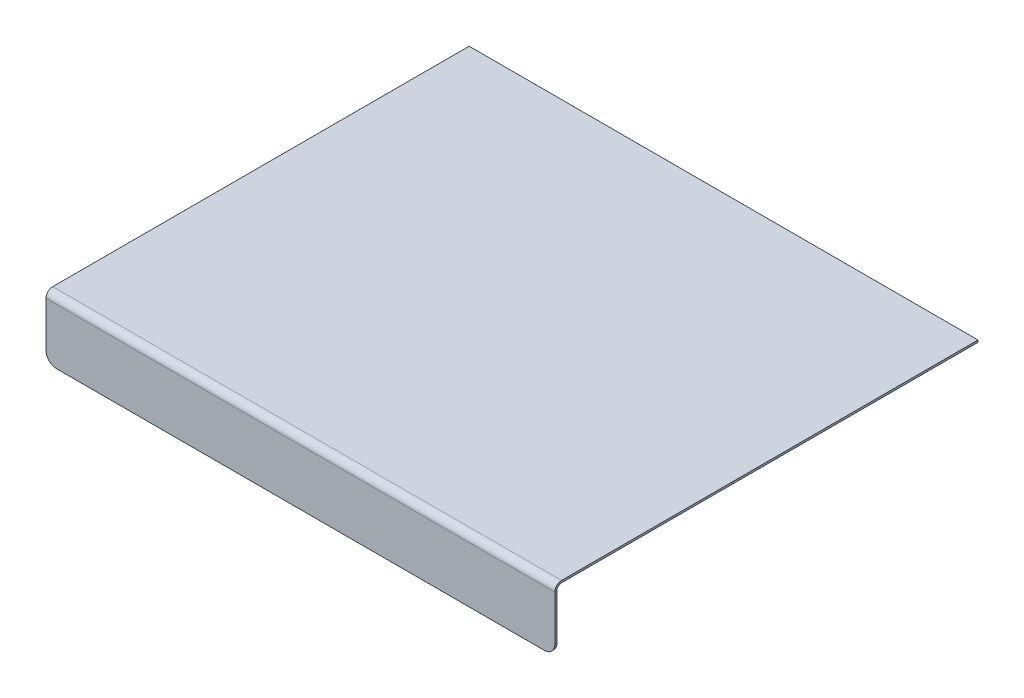
ISO-10303-21;
HEADER;
FILE_DESCRIPTION(('STEP AP214'),'2;1');
FILE_NAME('part.step','',(''),(''),'','','');
FILE_SCHEMA(('AUTOMOTIVE_DESIGN { 1 0 10303 214 1 1 1 1 }'));
ENDSEC;
DATA;
#1=APPLICATION_CONTEXT('core data for automotive mechanical design processes');
#2=APPLICATION_PROTOCOL_DEFINITION('international standard','automotive_design',2000,#1);
#3=PRODUCT_CONTEXT('',#1,'mechanical');
#4=PRODUCT('Part','Part','',(#3));
#5=PRODUCT_RELATED_PRODUCT_CATEGORY('part','',(#4));
#6=PRODUCT_DEFINITION_FORMATION('','',#4);
#7=PRODUCT_DEFINITION_CONTEXT('part definition',#1,'design');
#8=PRODUCT_DEFINITION('design','',#6,#7);
#9=PRODUCT_DEFINITION_SHAPE('','',#8);
#10=(LENGTH_UNIT() NAMED_UNIT(*) SI_UNIT(.MILLI.,.METRE.));
#11=(NAMED_UNIT(*) PLANE_ANGLE_UNIT() SI_UNIT($,.RADIAN.));
#12=(NAMED_UNIT(*) SI_UNIT($,.STERADIAN.) SOLID_ANGLE_UNIT());
#13=UNCERTAINTY_MEASURE_WITH_UNIT(LENGTH_MEASURE(1.E-05),#10,'distance_accuracy_value','');
#14=(GEOMETRIC_REPRESENTATION_CONTEXT(3) GLOBAL_UNCERTAINTY_ASSIGNED_CONTEXT((#13)) GLOBAL_UNIT_ASSIGNED_CONTEXT((#10,
#11,#12)) REPRESENTATION_CONTEXT('',''));
#15=CARTESIAN_POINT('',(0.,0.,0.));
#16=DIRECTION('',(0.,0.,1.));
#17=DIRECTION('',(1.,0.,0.));
#18=AXIS2_PLACEMENT_3D('',#15,#16,#17);
#19=CARTESIAN_POINT('',(-11.811,1.23410604029978,-36.8905693736669));
#20=DIRECTION('',(0.,0.,1.));
#21=DIRECTION('',(1.,0.,0.));
#22=AXIS2_PLACEMENT_3D('',#19,#20,#21);
#23=CYLINDRICAL_SURFACE('',#22,0.508);
#24=DIRECTION('',(0.,0.,1.));
#25=VECTOR('',#24,1.);
#26=CARTESIAN_POINT('',(-12.319,1.23410604029978,-36.8905693736669));
#27=LINE('',#26,#25);
#28=CARTESIAN_POINT('',(-12.319,1.23410604029978,-36.9896293736669));
#29=VERTEX_POINT('',#28);
#30=CARTESIAN_POINT('',(-12.319,1.23410604029978,-36.8905693736669));
#31=VERTEX_POINT('',#30);
#32=EDGE_CURVE('E13',#29,#31,#27,.T.);
#33=ORIENTED_EDGE('',*,*,#32,.F.);
#34=CARTESIAN_POINT('',(-11.811,1.23410604029978,-36.9896293736669));
#35=DIRECTION('',(0.,0.,1.));
#36=DIRECTION('',(1.,0.,0.));
#37=AXIS2_PLACEMENT_3D('',#34,#35,#36);
#38=CIRCLE('',#37,0.508);
#39=CARTESIAN_POINT('',(-11.811,0.72610604029978,-36.9896293736669));
#40=VERTEX_POINT('',#39);
#41=EDGE_CURVE('E105',#29,#40,#38,.T.);
#42=ORIENTED_EDGE('',*,*,#41,.T.);
#43=DIRECTION('',(0.,0.,1.));
#44=VECTOR('',#43,1.);
#45=CARTESIAN_POINT('',(-11.811,0.726106040299779,-36.8905693736669));
#46=LINE('',#45,#44);
#47=CARTESIAN_POINT('',(-11.811,0.726106040299779,-36.8905693736669));
#48=VERTEX_POINT('',#47);
#49=EDGE_CURVE('E60',#40,#48,#46,.T.);
#50=ORIENTED_EDGE('',*,*,#49,.T.);
#51=CARTESIAN_POINT('',(-11.811,1.23410604029978,-36.8905693736669));
#52=DIRECTION('',(0.,0.,1.));
#53=DIRECTION('',(1.,0.,0.));
#54=AXIS2_PLACEMENT_3D('',#51,#52,#53);
#55=CIRCLE('',#54,0.508);
#56=EDGE_CURVE('E107',#31,#48,#55,.T.);
#57=ORIENTED_EDGE('',*,*,#56,.F.);
#58=EDGE_LOOP('',(#33,#42,#50,#57));
#59=FACE_BOUND('',#58,.T.);
#60=ADVANCED_FACE('F50',(#59),#23,.T.);
#61=CARTESIAN_POINT('',(12.319,0.726106040299779,-36.8905693736669));
#62=DIRECTION('',(0.,1.,0.));
#63=DIRECTION('',(-1.,0.,0.));
#64=AXIS2_PLACEMENT_3D('',#61,#62,#63);
#65=PLANE('',#64);
#66=ORIENTED_EDGE('',*,*,#49,.F.);
#67=DIRECTION('',(1.,0.,0.));
#68=VECTOR('',#67,1.);
#69=CARTESIAN_POINT('',(12.319,0.72610604029978,-36.9896293736669));
#70=LINE('',#69,#68);
#71=CARTESIAN_POINT('',(11.811,0.72610604029978,-36.9896293736669));
#72=VERTEX_POINT('',#71);
#73=EDGE_CURVE('E121',#72,#40,#70,.F.);
#74=ORIENTED_EDGE('',*,*,#73,.F.);
#75=DIRECTION('',(0.,0.,1.));
#76=VECTOR('',#75,1.);
#77=CARTESIAN_POINT('',(11.811,0.726106040299779,-36.8905693736669));
#78=LINE('',#77,#76);
#79=CARTESIAN_POINT('',(11.811,0.726106040299779,-36.8905693736669));
#80=VERTEX_POINT('',#79);
#81=EDGE_CURVE('E144',#72,#80,#78,.T.);
#82=ORIENTED_EDGE('',*,*,#81,.T.);
#83=DIRECTION('',(-1.,0.,0.));
#84=VECTOR('',#83,1.);
#85=CARTESIAN_POINT('',(12.319,0.726106040299779,-36.8905693736669));
#86=LINE('',#85,#84);
#87=EDGE_CURVE('E156',#80,#48,#86,.T.);
#88=ORIENTED_EDGE('',*,*,#87,.T.);
#89=EDGE_LOOP('',(#66,#74,#82,#88));
#90=FACE_BOUND('',#89,.T.);
#91=ADVANCED_FACE('F161',(#90),#65,.F.);
#92=CARTESIAN_POINT('',(11.811,1.23410604029978,-36.8905693736669));
#93=DIRECTION('',(0.,0.,1.));
#94=DIRECTION('',(1.,0.,0.));
#95=AXIS2_PLACEMENT_3D('',#92,#93,#94);
#96=CYLINDRICAL_SURFACE('',#95,0.508);
#97=ORIENTED_EDGE('',*,*,#81,.F.);
#98=CARTESIAN_POINT('',(11.811,1.23410604029978,-36.9896293736669));
#99=DIRECTION('',(0.,0.,1.));
#100=DIRECTION('',(1.,0.,0.));
#101=AXIS2_PLACEMENT_3D('',#98,#99,#100);
#102=CIRCLE('',#101,0.508);
#103=CARTESIAN_POINT('',(12.319,1.23410604029978,-36.9896293736669));
#104=VERTEX_POINT('',#103);
#105=EDGE_CURVE('E211',#72,#104,#102,.T.);
#106=ORIENTED_EDGE('',*,*,#105,.T.);
#107=DIRECTION('',(0.,0.,1.));
#108=VECTOR('',#107,1.);
#109=CARTESIAN_POINT('',(12.319,1.23410604029978,-36.8905693736669));
#110=LINE('',#109,#108);
#111=CARTESIAN_POINT('',(12.319,1.23410604029978,-36.8905693736669));
#112=VERTEX_POINT('',#111);
#113=EDGE_CURVE('E141',#104,#112,#110,.T.);
#114=ORIENTED_EDGE('',*,*,#113,.T.);
#115=CARTESIAN_POINT('',(11.811,1.23410604029978,-36.8905693736669));
#116=DIRECTION('',(0.,0.,1.));
#117=DIRECTION('',(1.,0.,0.));
#118=AXIS2_PLACEMENT_3D('',#115,#116,#117);
#119=CIRCLE('',#118,0.508);
#120=EDGE_CURVE('E162',#80,#112,#119,.T.);
#121=ORIENTED_EDGE('',*,*,#120,.F.);
#122=EDGE_LOOP('',(#97,#106,#114,#121));
#123=FACE_BOUND('',#122,.T.);
#124=ADVANCED_FACE('F214',(#123),#96,.T.);
#125=CARTESIAN_POINT('',(12.319,1.29760604029978,-36.8905693736669));
#126=DIRECTION('',(1.,0.,0.));
#127=DIRECTION('',(0.,1.,0.));
#128=AXIS2_PLACEMENT_3D('',#125,#126,#127);
#129=PLANE('',#128);
#130=ORIENTED_EDGE('',*,*,#113,.F.);
#131=DIRECTION('',(0.,1.,0.));
#132=VECTOR('',#131,1.);
#133=CARTESIAN_POINT('',(12.319,1.29760604029978,-36.9896293736669));
#134=LINE('',#133,#132);
#135=CARTESIAN_POINT('',(12.319,3.42610604029978,-36.9896293736669));
#136=VERTEX_POINT('',#135);
#137=EDGE_CURVE('E192',#104,#136,#134,.T.);
#138=ORIENTED_EDGE('',*,*,#137,.T.);
#139=DIRECTION('',(0.,0.,1.));
#140=VECTOR('',#139,1.);
#141=CARTESIAN_POINT('',(12.319,3.42610604029978,-36.8905693736669));
#142=LINE('',#141,#140);
#143=CARTESIAN_POINT('',(12.319,3.42610604029978,-36.8905693736669));
#144=VERTEX_POINT('',#143);
#145=EDGE_CURVE('E138',#136,#144,#142,.T.);
#146=ORIENTED_EDGE('',*,*,#145,.T.);
#147=DIRECTION('',(0.,1.,0.));
#148=VECTOR('',#147,1.);
#149=CARTESIAN_POINT('',(12.319,1.29760604029978,-36.8905693736669));
#150=LINE('',#149,#148);
#151=EDGE_CURVE('E164',#112,#144,#150,.T.);
#152=ORIENTED_EDGE('',*,*,#151,.F.);
#153=EDGE_LOOP('',(#130,#138,#146,#152));
#154=FACE_BOUND('',#153,.T.);
#155=ADVANCED_FACE('F219',(#154),#129,.T.);
#156=CARTESIAN_POINT('',(12.319,3.42610604029978,-37.2146293736669));
#157=DIRECTION('',(-1.,0.,0.));
#158=DIRECTION('',(0.,0.,1.));
#159=AXIS2_PLACEMENT_3D('',#156,#157,#158);
#160=PLANE('',#159);
#161=ORIENTED_EDGE('',*,*,#145,.F.);
#162=CARTESIAN_POINT('',(12.319,3.42610604029978,-37.2146293736669));
#163=DIRECTION('',(-1.,0.,0.));
#164=DIRECTION('',(0.,0.,1.));
#165=AXIS2_PLACEMENT_3D('',#162,#163,#164);
#166=CIRCLE('',#165,0.225000000000002);
#167=CARTESIAN_POINT('',(12.319,3.65110604029978,-37.2146293736669));
#168=VERTEX_POINT('',#167);
#169=EDGE_CURVE('E200',#136,#168,#166,.T.);
#170=ORIENTED_EDGE('',*,*,#169,.T.);
#171=DIRECTION('',(0.,1.,0.));
#172=VECTOR('',#171,1.);
#173=CARTESIAN_POINT('',(12.319,3.75016604029978,-37.2146293736669));
#174=LINE('',#173,#172);
#175=CARTESIAN_POINT('',(12.319,3.75016604029978,-37.2146293736669));
#176=VERTEX_POINT('',#175);
#177=EDGE_CURVE('E135',#168,#176,#174,.T.);
#178=ORIENTED_EDGE('',*,*,#177,.T.);
#179=CARTESIAN_POINT('',(12.319,3.42610604029978,-37.2146293736669));
#180=DIRECTION('',(1.,0.,0.));
#181=DIRECTION('',(0.,0.,-1.));
#182=AXIS2_PLACEMENT_3D('',#179,#180,#181);
#183=CIRCLE('',#182,0.324060000000002);
#184=EDGE_CURVE('E186',#144,#176,#183,.F.);
#185=ORIENTED_EDGE('',*,*,#184,.F.);
#186=EDGE_LOOP('',(#161,#170,#178,#185));
#187=FACE_BOUND('',#186,.T.);
#188=ADVANCED_FACE('F227',(#187),#160,.F.);
#189=CARTESIAN_POINT('',(12.319,3.75016604029978,-37.2146293736669));
#190=DIRECTION('',(1.,0.,0.));
#191=DIRECTION('',(0.,0.,-1.));
#192=AXIS2_PLACEMENT_3D('',#189,#190,#191);
#193=PLANE('',#192);
#194=ORIENTED_EDGE('',*,*,#177,.F.);
#195=DIRECTION('',(0.,0.,1.));
#196=VECTOR('',#195,1.);
#197=CARTESIAN_POINT('',(12.319,3.65110604029978,-37.2146293736669));
#198=LINE('',#197,#196);
#199=CARTESIAN_POINT('',(12.319,3.65110604029978,-57.3800335132662));
#200=VERTEX_POINT('',#199);
#201=EDGE_CURVE('E196',#168,#200,#198,.F.);
#202=ORIENTED_EDGE('',*,*,#201,.T.);
#203=DIRECTION('',(0.,1.,0.));
#204=VECTOR('',#203,1.);
#205=CARTESIAN_POINT('',(12.319,3.75016604029978,-57.3800335132662));
#206=LINE('',#205,#204);
#207=CARTESIAN_POINT('',(12.319,3.75016604029978,-57.3800335132662));
#208=VERTEX_POINT('',#207);
#209=EDGE_CURVE('E133',#200,#208,#206,.T.);
#210=ORIENTED_EDGE('',*,*,#209,.T.);
#211=DIRECTION('',(0.,0.,-1.));
#212=VECTOR('',#211,1.);
#213=CARTESIAN_POINT('',(12.319,3.75016604029978,-37.2146293736669));
#214=LINE('',#213,#212);
#215=EDGE_CURVE('E178',#176,#208,#214,.T.);
#216=ORIENTED_EDGE('',*,*,#215,.F.);
#217=EDGE_LOOP('',(#194,#202,#210,#216));
#218=FACE_BOUND('',#217,.T.);
#219=ADVANCED_FACE('F272',(#218),#193,.T.);
#220=CARTESIAN_POINT('',(12.319,3.75016604029978,-57.3800335132662));
#221=DIRECTION('',(0.,0.,-1.));
#222=DIRECTION('',(-1.,0.,0.));
#223=AXIS2_PLACEMENT_3D('',#220,#221,#222);
#224=PLANE('',#223);
#225=ORIENTED_EDGE('',*,*,#209,.F.);
#226=DIRECTION('',(1.,0.,0.));
#227=VECTOR('',#226,1.);
#228=CARTESIAN_POINT('',(12.319,3.65110604029978,-57.3800335132662));
#229=LINE('',#228,#227);
#230=CARTESIAN_POINT('',(-12.319,3.65110604029978,-57.3800335132662));
#231=VERTEX_POINT('',#230);
#232=EDGE_CURVE('E201',#200,#231,#229,.F.);
#233=ORIENTED_EDGE('',*,*,#232,.T.);
#234=DIRECTION('',(0.,1.,0.));
#235=VECTOR('',#234,1.);
#236=CARTESIAN_POINT('',(-12.319,3.75016604029978,-57.3800335132662));
#237=LINE('',#236,#235);
#238=CARTESIAN_POINT('',(-12.319,3.75016604029978,-57.3800335132662));
#239=VERTEX_POINT('',#238);
#240=EDGE_CURVE('E68',#231,#239,#237,.T.);
#241=ORIENTED_EDGE('',*,*,#240,.T.);
#242=DIRECTION('',(-1.,0.,0.));
#243=VECTOR('',#242,1.);
#244=CARTESIAN_POINT('',(12.319,3.75016604029978,-57.3800335132662));
#245=LINE('',#244,#243);
#246=EDGE_CURVE('E181',#208,#239,#245,.T.);
#247=ORIENTED_EDGE('',*,*,#246,.F.);
#248=EDGE_LOOP('',(#225,#233,#241,#247));
#249=FACE_BOUND('',#248,.T.);
#250=ADVANCED_FACE('F257',(#249),#224,.T.);
#251=CARTESIAN_POINT('',(-12.319,3.75016604029978,-37.2146293736669));
#252=DIRECTION('',(1.,0.,0.));
#253=DIRECTION('',(0.,0.,-1.));
#254=AXIS2_PLACEMENT_3D('',#251,#252,#253);
#255=PLANE('',#254);
#256=ORIENTED_EDGE('',*,*,#240,.F.);
#257=DIRECTION('',(0.,0.,1.));
#258=VECTOR('',#257,1.);
#259=CARTESIAN_POINT('',(-12.319,3.65110604029978,-37.2146293736669));
#260=LINE('',#259,#258);
#261=CARTESIAN_POINT('',(-12.319,3.65110604029978,-37.2146293736669));
#262=VERTEX_POINT('',#261);
#263=EDGE_CURVE('E191',#262,#231,#260,.F.);
#264=ORIENTED_EDGE('',*,*,#263,.F.);
#265=DIRECTION('',(0.,1.,0.));
#266=VECTOR('',#265,1.);
#267=CARTESIAN_POINT('',(-12.319,3.75016604029978,-37.2146293736669));
#268=LINE('',#267,#266);
#269=CARTESIAN_POINT('',(-12.319,3.75016604029978,-37.2146293736669));
#270=VERTEX_POINT('',#269);
#271=EDGE_CURVE('E129',#262,#270,#268,.T.);
#272=ORIENTED_EDGE('',*,*,#271,.T.);
#273=DIRECTION('',(0.,0.,-1.));
#274=VECTOR('',#273,1.);
#275=CARTESIAN_POINT('',(-12.319,3.75016604029978,-37.2146293736669));
#276=LINE('',#275,#274);
#277=EDGE_CURVE('E172',#270,#239,#276,.T.);
#278=ORIENTED_EDGE('',*,*,#277,.T.);
#279=EDGE_LOOP('',(#256,#264,#272,#278));
#280=FACE_BOUND('',#279,.T.);
#281=ADVANCED_FACE('F247',(#280),#255,.F.);
#282=CARTESIAN_POINT('',(-12.319,3.42610604029978,-37.2146293736669));
#283=DIRECTION('',(-1.,0.,0.));
#284=DIRECTION('',(0.,0.,1.));
#285=AXIS2_PLACEMENT_3D('',#282,#283,#284);
#286=PLANE('',#285);
#287=ORIENTED_EDGE('',*,*,#271,.F.);
#288=CARTESIAN_POINT('',(-12.319,3.42610604029978,-37.2146293736669));
#289=DIRECTION('',(-1.,0.,0.));
#290=DIRECTION('',(0.,0.,1.));
#291=AXIS2_PLACEMENT_3D('',#288,#289,#290);
#292=CIRCLE('',#291,0.225000000000002);
#293=CARTESIAN_POINT('',(-12.319,3.42610604029978,-36.9896293736669));
#294=VERTEX_POINT('',#293);
#295=EDGE_CURVE('E197',#294,#262,#292,.T.);
#296=ORIENTED_EDGE('',*,*,#295,.F.);
#297=DIRECTION('',(0.,0.,1.));
#298=VECTOR('',#297,1.);
#299=CARTESIAN_POINT('',(-12.319,3.42610604029978,-36.8905693736669));
#300=LINE('',#299,#298);
#301=CARTESIAN_POINT('',(-12.319,3.42610604029978,-36.8905693736669));
#302=VERTEX_POINT('',#301);
#303=EDGE_CURVE('E54',#294,#302,#300,.T.);
#304=ORIENTED_EDGE('',*,*,#303,.T.);
#305=CARTESIAN_POINT('',(-12.319,3.42610604029978,-37.2146293736669));
#306=DIRECTION('',(1.,0.,0.));
#307=DIRECTION('',(0.,0.,-1.));
#308=AXIS2_PLACEMENT_3D('',#305,#306,#307);
#309=CIRCLE('',#308,0.324060000000002);
#310=EDGE_CURVE('E183',#302,#270,#309,.F.);
#311=ORIENTED_EDGE('',*,*,#310,.T.);
#312=EDGE_LOOP('',(#287,#296,#304,#311));
#313=FACE_BOUND('',#312,.T.);
#314=ADVANCED_FACE('F250',(#313),#286,.T.);
#315=CARTESIAN_POINT('',(-12.319,1.29760604029978,-36.8905693736669));
#316=DIRECTION('',(1.,0.,0.));
#317=DIRECTION('',(0.,1.,0.));
#318=AXIS2_PLACEMENT_3D('',#315,#316,#317);
#319=PLANE('',#318);
#320=DIRECTION('',(0.,1.,0.));
#321=VECTOR('',#320,1.);
#322=CARTESIAN_POINT('',(-12.319,1.29760604029978,-36.9896293736669));
#323=LINE('',#322,#321);
#324=EDGE_CURVE('E117',#29,#294,#323,.T.);
#325=ORIENTED_EDGE('',*,*,#324,.F.);
#326=ORIENTED_EDGE('',*,*,#32,.T.);
#327=DIRECTION('',(0.,1.,0.));
#328=VECTOR('',#327,1.);
#329=CARTESIAN_POINT('',(-12.319,1.29760604029978,-36.8905693736669));
#330=LINE('',#329,#328);
#331=EDGE_CURVE('E159',#31,#302,#330,.T.);
#332=ORIENTED_EDGE('',*,*,#331,.T.);
#333=ORIENTED_EDGE('',*,*,#303,.F.);
#334=EDGE_LOOP('',(#325,#326,#332,#333));
#335=FACE_BOUND('',#334,.T.);
#336=ADVANCED_FACE('F52',(#335),#319,.F.);
#337=CARTESIAN_POINT('',(12.319,3.42610604029978,-37.2146293736669));
#338=DIRECTION('',(-1.,0.,0.));
#339=DIRECTION('',(0.,0.,1.));
#340=AXIS2_PLACEMENT_3D('',#337,#338,#339);
#341=CYLINDRICAL_SURFACE('',#340,0.324060000000002);
#342=ORIENTED_EDGE('',*,*,#310,.F.);
#343=DIRECTION('',(-1.,0.,0.));
#344=VECTOR('',#343,1.);
#345=CARTESIAN_POINT('',(12.319,3.42610604029978,-36.8905693736669));
#346=LINE('',#345,#344);
#347=EDGE_CURVE('E170',#144,#302,#346,.T.);
#348=ORIENTED_EDGE('',*,*,#347,.F.);
#349=ORIENTED_EDGE('',*,*,#184,.T.);
#350=DIRECTION('',(-1.,0.,0.));
#351=VECTOR('',#350,1.);
#352=CARTESIAN_POINT('',(12.319,3.75016604029978,-37.2146293736669));
#353=LINE('',#352,#351);
#354=EDGE_CURVE('E175',#176,#270,#353,.T.);
#355=ORIENTED_EDGE('',*,*,#354,.T.);
#356=EDGE_LOOP('',(#342,#348,#349,#355));
#357=FACE_BOUND('',#356,.T.);
#358=ADVANCED_FACE('F236',(#357),#341,.T.);
#359=CARTESIAN_POINT('',(12.319,3.75016604029978,-37.2146293736669));
#360=DIRECTION('',(0.,1.,0.));
#361=DIRECTION('',(0.,0.,1.));
#362=AXIS2_PLACEMENT_3D('',#359,#360,#361);
#363=PLANE('',#362);
#364=ORIENTED_EDGE('',*,*,#277,.F.);
#365=ORIENTED_EDGE('',*,*,#354,.F.);
#366=ORIENTED_EDGE('',*,*,#215,.T.);
#367=ORIENTED_EDGE('',*,*,#246,.T.);
#368=EDGE_LOOP('',(#364,#365,#366,#367));
#369=FACE_BOUND('',#368,.T.);
#370=ADVANCED_FACE('F249',(#369),#363,.T.);
#371=CARTESIAN_POINT('',(12.319,1.29760604029978,-36.8905693736669));
#372=DIRECTION('',(0.,0.,1.));
#373=DIRECTION('',(1.,0.,0.));
#374=AXIS2_PLACEMENT_3D('',#371,#372,#373);
#375=PLANE('',#374);
#376=ORIENTED_EDGE('',*,*,#331,.F.);
#377=ORIENTED_EDGE('',*,*,#56,.T.);
#378=ORIENTED_EDGE('',*,*,#87,.F.);
#379=ORIENTED_EDGE('',*,*,#120,.T.);
#380=ORIENTED_EDGE('',*,*,#151,.T.);
#381=ORIENTED_EDGE('',*,*,#347,.T.);
#382=EDGE_LOOP('',(#376,#377,#378,#379,#380,#381));
#383=FACE_BOUND('',#382,.T.);
#384=ADVANCED_FACE('F154',(#383),#375,.T.);
#385=CARTESIAN_POINT('',(12.319,3.42610604029978,-37.2146293736669));
#386=DIRECTION('',(-1.,0.,0.));
#387=DIRECTION('',(0.,0.,1.));
#388=AXIS2_PLACEMENT_3D('',#385,#386,#387);
#389=CYLINDRICAL_SURFACE('',#388,0.225000000000002);
#390=ORIENTED_EDGE('',*,*,#295,.T.);
#391=DIRECTION('',(-1.,0.,0.));
#392=VECTOR('',#391,1.);
#393=CARTESIAN_POINT('',(12.319,3.65110604029978,-37.2146293736669));
#394=LINE('',#393,#392);
#395=EDGE_CURVE('E193',#168,#262,#394,.T.);
#396=ORIENTED_EDGE('',*,*,#395,.F.);
#397=ORIENTED_EDGE('',*,*,#169,.F.);
#398=DIRECTION('',(1.,0.,0.));
#399=VECTOR('',#398,1.);
#400=CARTESIAN_POINT('',(12.319,3.42610604029978,-36.9896293736669));
#401=LINE('',#400,#399);
#402=EDGE_CURVE('E189',#136,#294,#401,.F.);
#403=ORIENTED_EDGE('',*,*,#402,.T.);
#404=EDGE_LOOP('',(#390,#396,#397,#403));
#405=FACE_BOUND('',#404,.T.);
#406=ADVANCED_FACE('F224',(#405),#389,.F.);
#407=CARTESIAN_POINT('',(12.319,3.65110604029978,-37.2146293736669));
#408=DIRECTION('',(0.,1.,0.));
#409=DIRECTION('',(0.,0.,1.));
#410=AXIS2_PLACEMENT_3D('',#407,#408,#409);
#411=PLANE('',#410);
#412=ORIENTED_EDGE('',*,*,#263,.T.);
#413=ORIENTED_EDGE('',*,*,#232,.F.);
#414=ORIENTED_EDGE('',*,*,#201,.F.);
#415=ORIENTED_EDGE('',*,*,#395,.T.);
#416=EDGE_LOOP('',(#412,#413,#414,#415));
#417=FACE_BOUND('',#416,.T.);
#418=ADVANCED_FACE('F281',(#417),#411,.F.);
#419=CARTESIAN_POINT('',(12.319,1.29760604029978,-36.9896293736669));
#420=DIRECTION('',(0.,0.,1.));
#421=DIRECTION('',(1.,0.,0.));
#422=AXIS2_PLACEMENT_3D('',#419,#420,#421);
#423=PLANE('',#422);
#424=ORIENTED_EDGE('',*,*,#324,.T.);
#425=ORIENTED_EDGE('',*,*,#402,.F.);
#426=ORIENTED_EDGE('',*,*,#137,.F.);
#427=ORIENTED_EDGE('',*,*,#105,.F.);
#428=ORIENTED_EDGE('',*,*,#73,.T.);
#429=ORIENTED_EDGE('',*,*,#41,.F.);
#430=EDGE_LOOP('',(#424,#425,#426,#427,#428,#429));
#431=FACE_BOUND('',#430,.T.);
#432=ADVANCED_FACE('F115',(#431),#423,.F.);
#433=CLOSED_SHELL('',(#60,#91,#124,#155,#188,#219,#250,#281,#314,#336,#358,#370,#384,#406,#418,#432));
#434=MANIFOLD_SOLID_BREP('B2',#433);
#435=ADVANCED_BREP_SHAPE_REPRESENTATION('',(#18,#434),#14);
#436=SHAPE_DEFINITION_REPRESENTATION(#9,#435);
ENDSEC;
END-ISO-10303-21;
